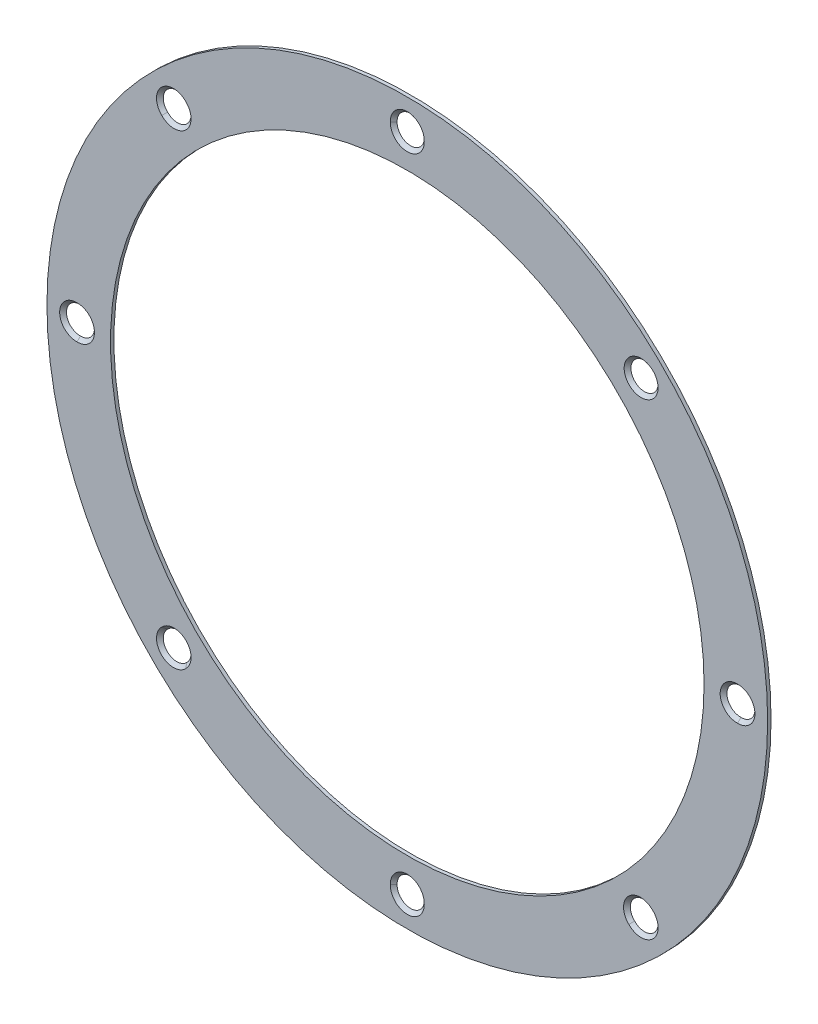
ISO-10303-21;
HEADER;
FILE_DESCRIPTION(('STEP AP214'),'2;1');
FILE_NAME('part.step','',(''),(''),'','','');
FILE_SCHEMA(('AUTOMOTIVE_DESIGN { 1 0 10303 214 1 1 1 1 }'));
ENDSEC;
DATA;
#1=APPLICATION_CONTEXT('core data for automotive mechanical design processes');
#2=APPLICATION_PROTOCOL_DEFINITION('international standard','automotive_design',2000,#1);
#3=PRODUCT_CONTEXT('',#1,'mechanical');
#4=PRODUCT('Part','Part','',(#3));
#5=PRODUCT_RELATED_PRODUCT_CATEGORY('part','',(#4));
#6=PRODUCT_DEFINITION_FORMATION('','',#4);
#7=PRODUCT_DEFINITION_CONTEXT('part definition',#1,'design');
#8=PRODUCT_DEFINITION('design','',#6,#7);
#9=PRODUCT_DEFINITION_SHAPE('','',#8);
#10=(LENGTH_UNIT() NAMED_UNIT(*) SI_UNIT(.MILLI.,.METRE.));
#11=(NAMED_UNIT(*) PLANE_ANGLE_UNIT() SI_UNIT($,.RADIAN.));
#12=(NAMED_UNIT(*) SI_UNIT($,.STERADIAN.) SOLID_ANGLE_UNIT());
#13=UNCERTAINTY_MEASURE_WITH_UNIT(LENGTH_MEASURE(1.E-05),#10,'distance_accuracy_value','');
#14=(GEOMETRIC_REPRESENTATION_CONTEXT(3) GLOBAL_UNCERTAINTY_ASSIGNED_CONTEXT((#13)) GLOBAL_UNIT_ASSIGNED_CONTEXT((#10,
#11,#12)) REPRESENTATION_CONTEXT('',''));
#15=CARTESIAN_POINT('',(0.,0.,0.));
#16=DIRECTION('',(0.,0.,1.));
#17=DIRECTION('',(1.,0.,0.));
#18=AXIS2_PLACEMENT_3D('',#15,#16,#17);
#19=CARTESIAN_POINT('',(0.,0.,0.));
#20=DIRECTION('',(0.,0.,1.));
#21=DIRECTION('',(1.,0.,0.));
#22=AXIS2_PLACEMENT_3D('',#19,#20,#21);
#23=PLANE('',#22);
#24=CARTESIAN_POINT('',(-55.0104462833951,55.0104462834001,0.));
#25=DIRECTION('',(0.,0.,1.));
#26=DIRECTION('',(1.,0.,0.));
#27=AXIS2_PLACEMENT_3D('',#24,#25,#26);
#28=CIRCLE('',#27,3.20000000000002);
#29=CARTESIAN_POINT('',(-57.343985371903,52.8207898440457,0.));
#30=VERTEX_POINT('',#29);
#31=CARTESIAN_POINT('',(-52.8207898440403,57.3439853719075,0.));
#32=VERTEX_POINT('',#31);
#33=EDGE_CURVE('E172',#30,#32,#28,.T.);
#34=ORIENTED_EDGE('',*,*,#33,.T.);
#35=CARTESIAN_POINT('',(-55.1543289325482,55.1543289325532,0.));
#36=DIRECTION('',(0.,0.,1.));
#37=DIRECTION('',(1.,0.,0.));
#38=AXIS2_PLACEMENT_3D('',#35,#36,#37);
#39=CIRCLE('',#38,3.20000000000002);
#40=EDGE_CURVE('E163',#32,#30,#39,.T.);
#41=ORIENTED_EDGE('',*,*,#40,.T.);
#42=EDGE_LOOP('',(#34,#41));
#43=FACE_BOUND('',#42,.T.);
#44=CARTESIAN_POINT('',(-77.7965192061775,3.36536354339501E-12,0.));
#45=DIRECTION('',(0.,0.,1.));
#46=DIRECTION('',(1.,0.,0.));
#47=AXIS2_PLACEMENT_3D('',#44,#45,#46);
#48=CIRCLE('',#47,3.20000000000001);
#49=CARTESIAN_POINT('',(-77.8982596030892,-3.19838223038066,0.));
#50=VERTEX_POINT('',#49);
#51=CARTESIAN_POINT('',(-77.8982596030883,3.19838223038742,0.));
#52=VERTEX_POINT('',#51);
#53=EDGE_CURVE('E189',#50,#52,#48,.T.);
#54=ORIENTED_EDGE('',*,*,#53,.T.);
#55=CARTESIAN_POINT('',(-78.,3.39225324350902E-12,0.));
#56=DIRECTION('',(0.,0.,1.));
#57=DIRECTION('',(1.,0.,0.));
#58=AXIS2_PLACEMENT_3D('',#55,#56,#57);
#59=CIRCLE('',#58,3.20000000000001);
#60=EDGE_CURVE('E180',#52,#50,#59,.T.);
#61=ORIENTED_EDGE('',*,*,#60,.T.);
#62=EDGE_LOOP('',(#54,#61));
#63=FACE_BOUND('',#62,.T.);
#64=CARTESIAN_POINT('',(-55.0104462833995,-55.0104462833957,0.));
#65=DIRECTION('',(0.,0.,1.));
#66=DIRECTION('',(1.,0.,0.));
#67=AXIS2_PLACEMENT_3D('',#64,#65,#66);
#68=CIRCLE('',#67,3.20000000000002);
#69=CARTESIAN_POINT('',(-52.8207898440514,-57.3439853719094,0.));
#70=VERTEX_POINT('',#69);
#71=CARTESIAN_POINT('',(-57.3439853719012,-52.8207898440347,0.));
#72=VERTEX_POINT('',#71);
#73=EDGE_CURVE('E200',#70,#72,#68,.T.);
#74=ORIENTED_EDGE('',*,*,#73,.T.);
#75=CARTESIAN_POINT('',(-55.154328932553,-55.1543289325484,0.));
#76=DIRECTION('',(0.,0.,1.));
#77=DIRECTION('',(1.,0.,0.));
#78=AXIS2_PLACEMENT_3D('',#75,#76,#77);
#79=CIRCLE('',#78,3.20000000000002);
#80=EDGE_CURVE('E178',#72,#70,#79,.T.);
#81=ORIENTED_EDGE('',*,*,#80,.T.);
#82=EDGE_LOOP('',(#74,#81));
#83=FACE_BOUND('',#82,.T.);
#84=CARTESIAN_POINT('',(-3.10168557504653E-12,-77.7965192061775,0.));
#85=DIRECTION('',(0.,0.,1.));
#86=DIRECTION('',(1.,0.,0.));
#87=AXIS2_PLACEMENT_3D('',#84,#85,#86);
#88=CIRCLE('',#87,3.20000000000001);
#89=CARTESIAN_POINT('',(3.19838223038121,-77.8982596030805,0.));
#90=VERTEX_POINT('',#89);
#91=CARTESIAN_POINT('',(-3.19838223038688,-77.898259603097,0.));
#92=VERTEX_POINT('',#91);
#93=EDGE_CURVE('E211',#90,#92,#88,.T.);
#94=ORIENTED_EDGE('',*,*,#93,.T.);
#95=CARTESIAN_POINT('',(-2.57524661021973E-12,-78.,0.));
#96=DIRECTION('',(0.,0.,1.));
#97=DIRECTION('',(1.,0.,0.));
#98=AXIS2_PLACEMENT_3D('',#95,#96,#97);
#99=CIRCLE('',#98,3.20000000000001);
#100=EDGE_CURVE('E194',#92,#90,#99,.T.);
#101=ORIENTED_EDGE('',*,*,#100,.T.);
#102=EDGE_LOOP('',(#94,#101));
#103=FACE_BOUND('',#102,.T.);
#104=CARTESIAN_POINT('',(55.0104462833955,-55.0104462833997,0.));
#105=DIRECTION('',(0.,0.,1.));
#106=DIRECTION('',(1.,0.,0.));
#107=AXIS2_PLACEMENT_3D('',#104,#105,#106);
#108=CIRCLE('',#107,3.20000000000002);
#109=CARTESIAN_POINT('',(57.3439853719034,-52.8207898440454,0.));
#110=VERTEX_POINT('',#109);
#111=CARTESIAN_POINT('',(52.8207898440407,-57.3439853719072,0.));
#112=VERTEX_POINT('',#111);
#113=EDGE_CURVE('E222',#110,#112,#108,.T.);
#114=ORIENTED_EDGE('',*,*,#113,.T.);
#115=CARTESIAN_POINT('',(55.1543289325486,-55.1543289325528,0.));
#116=DIRECTION('',(0.,0.,1.));
#117=DIRECTION('',(1.,0.,0.));
#118=AXIS2_PLACEMENT_3D('',#115,#116,#117);
#119=CIRCLE('',#118,3.20000000000002);
#120=EDGE_CURVE('E205',#112,#110,#119,.T.);
#121=ORIENTED_EDGE('',*,*,#120,.T.);
#122=EDGE_LOOP('',(#114,#121));
#123=FACE_BOUND('',#122,.T.);
#124=CARTESIAN_POINT('',(55.1543289325526,55.1543289325488,0.));
#125=DIRECTION('',(0.,0.,1.));
#126=DIRECTION('',(1.,0.,0.));
#127=AXIS2_PLACEMENT_3D('',#124,#125,#126);
#128=CIRCLE('',#127,3.20000000000002);
#129=CARTESIAN_POINT('',(58.3543289325526,55.1543289325488,0.));
#130=VERTEX_POINT('',#129);
#131=EDGE_CURVE('E228',#130,#130,#128,.T.);
#132=ORIENTED_EDGE('',*,*,#131,.T.);
#133=EDGE_LOOP('',(#132));
#134=FACE_BOUND('',#133,.T.);
#135=CARTESIAN_POINT('',(77.7965192061775,-2.81719092498633E-12,0.));
#136=DIRECTION('',(0.,0.,1.));
#137=DIRECTION('',(1.,0.,0.));
#138=AXIS2_PLACEMENT_3D('',#135,#136,#137);
#139=CIRCLE('',#138,3.20000000000001);
#140=CARTESIAN_POINT('',(77.8982596030892,3.19838223038121,0.));
#141=VERTEX_POINT('',#140);
#142=CARTESIAN_POINT('',(77.8982596030883,-3.19838223038687,0.));
#143=VERTEX_POINT('',#142);
#144=EDGE_CURVE('E234',#141,#143,#139,.T.);
#145=ORIENTED_EDGE('',*,*,#144,.T.);
#146=CARTESIAN_POINT('',(78.,-2.84758215464949E-12,0.));
#147=DIRECTION('',(0.,0.,1.));
#148=DIRECTION('',(1.,0.,0.));
#149=AXIS2_PLACEMENT_3D('',#146,#147,#148);
#150=CIRCLE('',#149,3.20000000000001);
#151=EDGE_CURVE('E216',#143,#141,#150,.T.);
#152=ORIENTED_EDGE('',*,*,#151,.T.);
#153=EDGE_LOOP('',(#145,#152));
#154=FACE_BOUND('',#153,.T.);
#155=CARTESIAN_POINT('',(0.,0.,0.));
#156=DIRECTION('',(0.,0.,1.));
#157=DIRECTION('',(1.,0.,0.));
#158=AXIS2_PLACEMENT_3D('',#155,#156,#157);
#159=CIRCLE('',#158,70.);
#160=CARTESIAN_POINT('',(70.,0.,0.));
#161=VERTEX_POINT('',#160);
#162=EDGE_CURVE('E240',#161,#161,#159,.T.);
#163=ORIENTED_EDGE('',*,*,#162,.T.);
#164=EDGE_LOOP('',(#163));
#165=FACE_BOUND('',#164,.T.);
#166=CARTESIAN_POINT('',(2.57524661021973E-12,78.,0.));
#167=DIRECTION('',(0.,0.,1.));
#168=DIRECTION('',(1.,0.,0.));
#169=AXIS2_PLACEMENT_3D('',#166,#167,#168);
#170=CIRCLE('',#169,3.20000000000001);
#171=CARTESIAN_POINT('',(3.19838223038715,77.8982596031054,0.));
#172=VERTEX_POINT('',#171);
#173=CARTESIAN_POINT('',(-3.19838223038094,77.8982596030721,0.));
#174=VERTEX_POINT('',#173);
#175=EDGE_CURVE('E246',#172,#174,#170,.T.);
#176=ORIENTED_EDGE('',*,*,#175,.T.);
#177=CARTESIAN_POINT('',(3.63598040564739E-12,77.7965192061775,0.));
#178=DIRECTION('',(0.,0.,1.));
#179=DIRECTION('',(1.,0.,0.));
#180=AXIS2_PLACEMENT_3D('',#177,#178,#179);
#181=CIRCLE('',#180,3.20000000000001);
#182=EDGE_CURVE('E709',#174,#172,#181,.T.);
#183=ORIENTED_EDGE('',*,*,#182,.T.);
#184=EDGE_LOOP('',(#176,#183));
#185=FACE_BOUND('',#184,.T.);
#186=CARTESIAN_POINT('',(0.,0.,0.));
#187=DIRECTION('',(0.,0.,1.));
#188=DIRECTION('',(1.,0.,0.));
#189=AXIS2_PLACEMENT_3D('',#186,#187,#188);
#190=CIRCLE('',#189,85.);
#191=CARTESIAN_POINT('',(85.,0.,0.));
#192=VERTEX_POINT('',#191);
#193=EDGE_CURVE('E254',#192,#192,#190,.T.);
#194=ORIENTED_EDGE('',*,*,#193,.F.);
#195=EDGE_LOOP('',(#194));
#196=FACE_BOUND('',#195,.T.);
#197=ADVANCED_FACE('F59',(#43,#63,#83,#103,#123,#134,#154,#165,#185,#196),#23,.F.);
#198=CARTESIAN_POINT('',(0.,0.,0.8));
#199=DIRECTION('',(0.,0.,1.));
#200=DIRECTION('',(1.,0.,0.));
#201=AXIS2_PLACEMENT_3D('',#198,#199,#200);
#202=PLANE('',#201);
#203=CARTESIAN_POINT('',(-55.1543289325482,55.1543289325532,0.8));
#204=DIRECTION('',(0.,0.,1.));
#205=DIRECTION('',(1.,0.,0.));
#206=AXIS2_PLACEMENT_3D('',#203,#204,#205);
#207=CIRCLE('',#206,4.00000000000001);
#208=CARTESIAN_POINT('',(-52.2548755486128,57.909899667335,0.8));
#209=VERTEX_POINT('',#208);
#210=CARTESIAN_POINT('',(-57.9098996673305,52.2548755486183,0.8));
#211=VERTEX_POINT('',#210);
#212=EDGE_CURVE('E79',#209,#211,#207,.T.);
#213=ORIENTED_EDGE('',*,*,#212,.F.);
#214=CARTESIAN_POINT('',(-55.0104462833951,55.0104462834001,0.8));
#215=DIRECTION('',(0.,0.,1.));
#216=DIRECTION('',(1.,0.,0.));
#217=AXIS2_PLACEMENT_3D('',#214,#215,#216);
#218=CIRCLE('',#217,4.00000000000001);
#219=EDGE_CURVE('E174',#211,#209,#218,.T.);
#220=ORIENTED_EDGE('',*,*,#219,.F.);
#221=EDGE_LOOP('',(#213,#220));
#222=FACE_BOUND('',#221,.T.);
#223=CARTESIAN_POINT('',(3.63598040564739E-12,77.7965192061775,0.8));
#224=DIRECTION('',(0.,0.,1.));
#225=DIRECTION('',(1.,0.,0.));
#226=AXIS2_PLACEMENT_3D('',#223,#224,#225);
#227=CIRCLE('',#226,4.00000000000001);
#228=CARTESIAN_POINT('',(-3.99870590211529,77.8982596030679,0.8));
#229=VERTEX_POINT('',#228);
#230=CARTESIAN_POINT('',(3.9987059021215,77.8982596031096,0.8));
#231=VERTEX_POINT('',#230);
#232=EDGE_CURVE('E87',#229,#231,#227,.T.);
#233=ORIENTED_EDGE('',*,*,#232,.F.);
#234=CARTESIAN_POINT('',(2.57524661021973E-12,78.,0.8));
#235=DIRECTION('',(0.,0.,1.));
#236=DIRECTION('',(1.,0.,0.));
#237=AXIS2_PLACEMENT_3D('',#234,#235,#236);
#238=CIRCLE('',#237,4.00000000000001);
#239=EDGE_CURVE('E243',#231,#229,#238,.T.);
#240=ORIENTED_EDGE('',*,*,#239,.F.);
#241=EDGE_LOOP('',(#233,#240));
#242=FACE_BOUND('',#241,.T.);
#243=CARTESIAN_POINT('',(-78.,3.39225324350902E-12,0.8));
#244=DIRECTION('',(0.,0.,1.));
#245=DIRECTION('',(1.,0.,0.));
#246=AXIS2_PLACEMENT_3D('',#243,#244,#245);
#247=CIRCLE('',#246,4.00000000000002);
#248=CARTESIAN_POINT('',(-77.8982596030882,3.99870590212177,0.8));
#249=VERTEX_POINT('',#248);
#250=CARTESIAN_POINT('',(-77.8982596030893,-3.99870590211502,0.8));
#251=VERTEX_POINT('',#250);
#252=EDGE_CURVE('E714',#249,#251,#247,.T.);
#253=ORIENTED_EDGE('',*,*,#252,.F.);
#254=CARTESIAN_POINT('',(-77.7965192061775,3.36536354339501E-12,0.8));
#255=DIRECTION('',(0.,0.,1.));
#256=DIRECTION('',(1.,0.,0.));
#257=AXIS2_PLACEMENT_3D('',#254,#255,#256);
#258=CIRCLE('',#257,4.00000000000002);
#259=EDGE_CURVE('E186',#251,#249,#258,.T.);
#260=ORIENTED_EDGE('',*,*,#259,.F.);
#261=EDGE_LOOP('',(#253,#260));
#262=FACE_BOUND('',#261,.T.);
#263=CARTESIAN_POINT('',(-55.154328932553,-55.1543289325484,0.8));
#264=DIRECTION('',(0.,0.,1.));
#265=DIRECTION('',(1.,0.,0.));
#266=AXIS2_PLACEMENT_3D('',#263,#264,#265);
#267=CIRCLE('',#266,4.00000000000001);
#268=CARTESIAN_POINT('',(-57.9098996673272,-52.2548755486058,0.8));
#269=VERTEX_POINT('',#268);
#270=CARTESIAN_POINT('',(-52.2548755486255,-57.9098996673385,0.8));
#271=VERTEX_POINT('',#270);
#272=EDGE_CURVE('E176',#269,#271,#267,.T.);
#273=ORIENTED_EDGE('',*,*,#272,.F.);
#274=CARTESIAN_POINT('',(-55.0104462833995,-55.0104462833957,0.8));
#275=DIRECTION('',(0.,0.,1.));
#276=DIRECTION('',(1.,0.,0.));
#277=AXIS2_PLACEMENT_3D('',#274,#275,#276);
#278=CIRCLE('',#277,4.00000000000002);
#279=EDGE_CURVE('E197',#271,#269,#278,.T.);
#280=ORIENTED_EDGE('',*,*,#279,.F.);
#281=EDGE_LOOP('',(#273,#280));
#282=FACE_BOUND('',#281,.T.);
#283=CARTESIAN_POINT('',(-2.57524661021973E-12,-78.,0.8));
#284=DIRECTION('',(0.,0.,1.));
#285=DIRECTION('',(1.,0.,0.));
#286=AXIS2_PLACEMENT_3D('',#283,#284,#285);
#287=CIRCLE('',#286,4.00000000000001);
#288=CARTESIAN_POINT('',(-3.99870590212123,-77.8982596030991,0.8));
#289=VERTEX_POINT('',#288);
#290=CARTESIAN_POINT('',(3.99870590211555,-77.8982596030784,0.8));
#291=VERTEX_POINT('',#290);
#292=EDGE_CURVE('E192',#289,#291,#287,.T.);
#293=ORIENTED_EDGE('',*,*,#292,.F.);
#294=CARTESIAN_POINT('',(-3.10168557504653E-12,-77.7965192061775,0.8));
#295=DIRECTION('',(0.,0.,1.));
#296=DIRECTION('',(1.,0.,0.));
#297=AXIS2_PLACEMENT_3D('',#294,#295,#296);
#298=CIRCLE('',#297,4.00000000000001);
#299=EDGE_CURVE('E208',#291,#289,#298,.T.);
#300=ORIENTED_EDGE('',*,*,#299,.F.);
#301=EDGE_LOOP('',(#293,#300));
#302=FACE_BOUND('',#301,.T.);
#303=CARTESIAN_POINT('',(55.1543289325486,-55.1543289325528,0.8));
#304=DIRECTION('',(0.,0.,1.));
#305=DIRECTION('',(1.,0.,0.));
#306=AXIS2_PLACEMENT_3D('',#303,#304,#305);
#307=CIRCLE('',#306,4.00000000000002);
#308=CARTESIAN_POINT('',(52.2548755486132,-57.9098996673346,0.8));
#309=VERTEX_POINT('',#308);
#310=CARTESIAN_POINT('',(57.9098996673309,-52.2548755486179,0.8));
#311=VERTEX_POINT('',#310);
#312=EDGE_CURVE('E203',#309,#311,#307,.T.);
#313=ORIENTED_EDGE('',*,*,#312,.F.);
#314=CARTESIAN_POINT('',(55.0104462833955,-55.0104462833997,0.8));
#315=DIRECTION('',(0.,0.,1.));
#316=DIRECTION('',(1.,0.,0.));
#317=AXIS2_PLACEMENT_3D('',#314,#315,#316);
#318=CIRCLE('',#317,4.00000000000002);
#319=EDGE_CURVE('E219',#311,#309,#318,.T.);
#320=ORIENTED_EDGE('',*,*,#319,.F.);
#321=EDGE_LOOP('',(#313,#320));
#322=FACE_BOUND('',#321,.T.);
#323=CARTESIAN_POINT('',(78.,-2.84758215464949E-12,0.8));
#324=DIRECTION('',(0.,0.,1.));
#325=DIRECTION('',(1.,0.,0.));
#326=AXIS2_PLACEMENT_3D('',#323,#324,#325);
#327=CIRCLE('',#326,4.00000000000002);
#328=CARTESIAN_POINT('',(77.8982596030882,-3.99870590212123,0.8));
#329=VERTEX_POINT('',#328);
#330=CARTESIAN_POINT('',(77.8982596030894,3.99870590211556,0.8));
#331=VERTEX_POINT('',#330);
#332=EDGE_CURVE('E214',#329,#331,#327,.T.);
#333=ORIENTED_EDGE('',*,*,#332,.F.);
#334=CARTESIAN_POINT('',(77.7965192061775,-2.81719092498633E-12,0.8));
#335=DIRECTION('',(0.,0.,1.));
#336=DIRECTION('',(1.,0.,0.));
#337=AXIS2_PLACEMENT_3D('',#334,#335,#336);
#338=CIRCLE('',#337,4.00000000000002);
#339=EDGE_CURVE('E231',#331,#329,#338,.T.);
#340=ORIENTED_EDGE('',*,*,#339,.F.);
#341=EDGE_LOOP('',(#333,#340));
#342=FACE_BOUND('',#341,.T.);
#343=CARTESIAN_POINT('',(55.1543289325526,55.1543289325488,0.8));
#344=DIRECTION('',(0.,0.,1.));
#345=DIRECTION('',(1.,0.,0.));
#346=AXIS2_PLACEMENT_3D('',#343,#344,#345);
#347=CIRCLE('',#346,4.00000000000002);
#348=CARTESIAN_POINT('',(59.1543289325526,55.1543289325488,0.8));
#349=VERTEX_POINT('',#348);
#350=EDGE_CURVE('E225',#349,#349,#347,.T.);
#351=ORIENTED_EDGE('',*,*,#350,.F.);
#352=EDGE_LOOP('',(#351));
#353=FACE_BOUND('',#352,.T.);
#354=CARTESIAN_POINT('',(0.,0.,0.799999999999993));
#355=DIRECTION('',(0.,0.,1.));
#356=DIRECTION('',(1.,0.,0.));
#357=AXIS2_PLACEMENT_3D('',#354,#355,#356);
#358=CIRCLE('',#357,70.);
#359=CARTESIAN_POINT('',(70.,0.,0.799999999999993));
#360=VERTEX_POINT('',#359);
#361=EDGE_CURVE('E237',#360,#360,#358,.T.);
#362=ORIENTED_EDGE('',*,*,#361,.F.);
#363=EDGE_LOOP('',(#362));
#364=FACE_BOUND('',#363,.T.);
#365=CARTESIAN_POINT('',(0.,0.,0.8));
#366=DIRECTION('',(0.,0.,1.));
#367=DIRECTION('',(1.,0.,0.));
#368=AXIS2_PLACEMENT_3D('',#365,#366,#367);
#369=CIRCLE('',#368,85.);
#370=CARTESIAN_POINT('',(85.,0.,0.8));
#371=VERTEX_POINT('',#370);
#372=EDGE_CURVE('E249',#371,#371,#369,.T.);
#373=ORIENTED_EDGE('',*,*,#372,.T.);
#374=EDGE_LOOP('',(#373));
#375=FACE_BOUND('',#374,.T.);
#376=ADVANCED_FACE('F537',(#222,#242,#262,#282,#302,#322,#342,#353,#364,#375),#202,.T.);
#377=CARTESIAN_POINT('',(0.,0.,0.8));
#378=DIRECTION('',(0.,0.,-1.));
#379=DIRECTION('',(-1.,0.,0.));
#380=AXIS2_PLACEMENT_3D('',#377,#378,#379);
#381=CYLINDRICAL_SURFACE('',#380,85.);
#382=ORIENTED_EDGE('',*,*,#193,.T.);
#383=EDGE_LOOP('',(#382));
#384=FACE_BOUND('',#383,.T.);
#385=ORIENTED_EDGE('',*,*,#372,.F.);
#386=EDGE_LOOP('',(#385));
#387=FACE_BOUND('',#386,.T.);
#388=ADVANCED_FACE('F535',(#384,#387),#381,.T.);
#389=CARTESIAN_POINT('',(2.57524661021973E-12,78.,0.8));
#390=DIRECTION('',(0.,0.,1.));
#391=DIRECTION('',(1.,0.,0.));
#392=AXIS2_PLACEMENT_3D('',#389,#390,#391);
#393=CONICAL_SURFACE('',#392,4.00000000000001,0.785398163397452);
#394=ORIENTED_EDGE('',*,*,#239,.T.);
#395=CARTESIAN_POINT('',(-3.99890596683793,77.8982596030679,0.80020000000005));
#396=CARTESIAN_POINT('',(-3.86545799511278,77.8982596030686,0.666793996374641));
#397=CARTESIAN_POINT('',(-3.7320070227852,77.8982596030693,0.533390994565683));
#398=CARTESIAN_POINT('',(-3.46509907691018,77.8982596030707,0.266590994565668));
#399=CARTESIAN_POINT('',(-3.33164210336274,77.8982596030714,0.13319399637461));
#400=CARTESIAN_POINT('',(-3.19818212921287,77.8982596030721,-0.000199999999994917));
#401=B_SPLINE_CURVE_WITH_KNOTS('',3,(#395,#396,#397,#398,#399,#400),.UNSPECIFIED.,.F.,.F.,(4,2,
4),(0.,0.566082773242,1.13216554654768),.UNSPECIFIED.);
#402=EDGE_CURVE('E520',#229,#174,#401,.T.);
#403=ORIENTED_EDGE('',*,*,#402,.T.);
#404=ORIENTED_EDGE('',*,*,#175,.F.);
#405=CARTESIAN_POINT('',(3.19818212921908,77.8982596031054,-0.000199999999994968));
#406=CARTESIAN_POINT('',(3.33164210336895,77.8982596031061,0.13319399637461));
#407=CARTESIAN_POINT('',(3.46509907691639,77.8982596031068,0.266590994565668));
#408=CARTESIAN_POINT('',(3.73200702279141,77.8982596031082,0.533390994565684));
#409=CARTESIAN_POINT('',(3.86545799511899,77.8982596031089,0.666793996374641));
#410=CARTESIAN_POINT('',(3.99890596684414,77.8982596031096,0.800200000000051));
#411=B_SPLINE_CURVE_WITH_KNOTS('',3,(#405,#406,#407,#408,#409,#410),.UNSPECIFIED.,.F.,.F.,(4,2,
4),(0.,0.566082773305678,1.13216554654768),.UNSPECIFIED.);
#412=EDGE_CURVE('E502',#172,#231,#411,.T.);
#413=ORIENTED_EDGE('',*,*,#412,.T.);
#414=EDGE_LOOP('',(#394,#403,#404,#413));
#415=FACE_BOUND('',#414,.T.);
#416=ADVANCED_FACE('F530',(#415),#393,.F.);
#417=CARTESIAN_POINT('',(0.,0.,0.8));
#418=DIRECTION('',(0.,0.,1.));
#419=DIRECTION('',(1.,0.,0.));
#420=AXIS2_PLACEMENT_3D('',#417,#418,#419);
#421=CYLINDRICAL_SURFACE('',#420,70.);
#422=ORIENTED_EDGE('',*,*,#162,.F.);
#423=EDGE_LOOP('',(#422));
#424=FACE_BOUND('',#423,.T.);
#425=ORIENTED_EDGE('',*,*,#361,.T.);
#426=EDGE_LOOP('',(#425));
#427=FACE_BOUND('',#426,.T.);
#428=ADVANCED_FACE('F534',(#424,#427),#421,.F.);
#429=CARTESIAN_POINT('',(77.7965192061775,-2.81719092498633E-12,0.8));
#430=DIRECTION('',(0.,0.,1.));
#431=DIRECTION('',(1.,0.,0.));
#432=AXIS2_PLACEMENT_3D('',#429,#430,#431);
#433=CONICAL_SURFACE('',#432,4.00000000000002,0.785398163397457);
#434=ORIENTED_EDGE('',*,*,#339,.T.);
#435=CARTESIAN_POINT('',(77.8982596030882,-3.99890596684387,0.80020000000005));
#436=CARTESIAN_POINT('',(77.8982596030882,-3.86545799511872,0.666793996374641));
#437=CARTESIAN_POINT('',(77.8982596030882,-3.73200702279114,0.533390994565683));
#438=CARTESIAN_POINT('',(77.8982596030882,-3.46509907691611,0.266590994565667));
#439=CARTESIAN_POINT('',(77.8982596030883,-3.33164210336867,0.133193996374609));
#440=CARTESIAN_POINT('',(77.8982596030883,-3.1981821292188,-0.000199999999995134));
#441=B_SPLINE_CURVE_WITH_KNOTS('',3,(#435,#436,#437,#438,#439,#440),.UNSPECIFIED.,.F.,.F.,(4,2,
4),(0.,0.566082773242003,1.13216554654768),.UNSPECIFIED.);
#442=EDGE_CURVE('E402',#329,#143,#441,.T.);
#443=ORIENTED_EDGE('',*,*,#442,.T.);
#444=ORIENTED_EDGE('',*,*,#144,.F.);
#445=CARTESIAN_POINT('',(77.8982596030892,3.19818212921314,-0.000199999999994853));
#446=CARTESIAN_POINT('',(77.8982596030893,3.33164210336301,0.13319399637461));
#447=CARTESIAN_POINT('',(77.8982596030893,3.46509907691045,0.266590994565667));
#448=CARTESIAN_POINT('',(77.8982596030893,3.73200702278547,0.533390994565683));
#449=CARTESIAN_POINT('',(77.8982596030893,3.86545799511305,0.66679399637464));
#450=CARTESIAN_POINT('',(77.8982596030894,3.99890596683821,0.80020000000005));
#451=B_SPLINE_CURVE_WITH_KNOTS('',3,(#445,#446,#447,#448,#449,#450),.UNSPECIFIED.,.F.,.F.,(4,2,
4),(0.,0.566082773305681,1.13216554654768),.UNSPECIFIED.);
#452=EDGE_CURVE('E393',#141,#331,#451,.T.);
#453=ORIENTED_EDGE('',*,*,#452,.T.);
#454=EDGE_LOOP('',(#434,#443,#444,#453));
#455=FACE_BOUND('',#454,.T.);
#456=ADVANCED_FACE('F408',(#455),#433,.F.);
#457=CARTESIAN_POINT('',(55.1543289325526,55.1543289325488,0.8));
#458=DIRECTION('',(0.,0.,1.));
#459=DIRECTION('',(1.,0.,0.));
#460=AXIS2_PLACEMENT_3D('',#457,#458,#459);
#461=CONICAL_SURFACE('',#460,4.00000000000002,0.785398163397453);
#462=ORIENTED_EDGE('',*,*,#131,.F.);
#463=EDGE_LOOP('',(#462));
#464=FACE_BOUND('',#463,.T.);
#465=ORIENTED_EDGE('',*,*,#350,.T.);
#466=EDGE_LOOP('',(#465));
#467=FACE_BOUND('',#466,.T.);
#468=ADVANCED_FACE('F425',(#464,#467),#461,.F.);
#469=CARTESIAN_POINT('',(55.0104462833955,-55.0104462833997,0.8));
#470=DIRECTION('',(0.,0.,1.));
#471=DIRECTION('',(1.,0.,0.));
#472=AXIS2_PLACEMENT_3D('',#469,#470,#471);
#473=CONICAL_SURFACE('',#472,4.00000000000002,0.785398163397453);
#474=ORIENTED_EDGE('',*,*,#319,.T.);
#475=CARTESIAN_POINT('',(52.2547340814912,-57.9100411344566,0.8002));
#476=CARTESIAN_POINT('',(52.3490960472336,-57.8156791687142,0.666793996374599));
#477=CARTESIAN_POINT('',(52.4434601347224,-57.7213150812254,0.53339099456565));
#478=CARTESIAN_POINT('',(52.6321925532032,-57.5325826627446,0.26659099456565));
#479=CARTESIAN_POINT('',(52.7265608841952,-57.4382143317526,0.133193996374599));
#480=CARTESIAN_POINT('',(52.8209313369336,-57.3438438790143,-0.000199999999998221));
#481=B_SPLINE_CURVE_WITH_KNOTS('',3,(#475,#476,#477,#478,#479,#480),.UNSPECIFIED.,.F.,.F.,(4,2,
4),(0.,0.566082773241963,1.13216554654761),.UNSPECIFIED.);
#482=EDGE_CURVE('E434',#309,#112,#481,.T.);
#483=ORIENTED_EDGE('',*,*,#482,.T.);
#484=ORIENTED_EDGE('',*,*,#113,.F.);
#485=CARTESIAN_POINT('',(57.3438438790105,-52.8209313369382,-0.00019999999996513));
#486=CARTESIAN_POINT('',(57.4382143317489,-52.7265608841999,0.133193996374626));
#487=CARTESIAN_POINT('',(57.5325826627409,-52.6321925532079,0.26659099456567));
#488=CARTESIAN_POINT('',(57.7213150812217,-52.4434601347271,0.533390994565658));
#489=CARTESIAN_POINT('',(57.8156791687105,-52.3490960472383,0.666793996374602));
#490=CARTESIAN_POINT('',(57.9100411344529,-52.2547340814959,0.800199999999999));
#491=B_SPLINE_CURVE_WITH_KNOTS('',3,(#485,#486,#487,#488,#489,#490),.UNSPECIFIED.,.F.,.F.,(4,2,
4),(0.,0.566082773305619,1.13216554654756),.UNSPECIFIED.);
#492=EDGE_CURVE('E428',#110,#311,#491,.T.);
#493=ORIENTED_EDGE('',*,*,#492,.T.);
#494=EDGE_LOOP('',(#474,#483,#484,#493));
#495=FACE_BOUND('',#494,.T.);
#496=ADVANCED_FACE('F418',(#495),#473,.F.);
#497=CARTESIAN_POINT('',(78.,-2.84758215464949E-12,0.8));
#498=DIRECTION('',(0.,0.,1.));
#499=DIRECTION('',(1.,0.,0.));
#500=AXIS2_PLACEMENT_3D('',#497,#498,#499);
#501=CONICAL_SURFACE('',#500,4.00000000000002,0.785398163397457);
#502=ORIENTED_EDGE('',*,*,#332,.T.);
#503=ORIENTED_EDGE('',*,*,#452,.F.);
#504=ORIENTED_EDGE('',*,*,#151,.F.);
#505=ORIENTED_EDGE('',*,*,#442,.F.);
#506=EDGE_LOOP('',(#502,#503,#504,#505));
#507=FACE_BOUND('',#506,.T.);
#508=ADVANCED_FACE('F412',(#507),#501,.F.);
#509=CARTESIAN_POINT('',(-3.10168557504653E-12,-77.7965192061775,0.8));
#510=DIRECTION('',(0.,0.,1.));
#511=DIRECTION('',(1.,0.,0.));
#512=AXIS2_PLACEMENT_3D('',#509,#510,#511);
#513=CONICAL_SURFACE('',#512,4.00000000000001,0.785398163397452);
#514=ORIENTED_EDGE('',*,*,#299,.T.);
#515=CARTESIAN_POINT('',(-3.99890596684388,-77.8982596030991,0.80020000000005));
#516=CARTESIAN_POINT('',(-3.86545799511872,-77.8982596030988,0.666793996374641));
#517=CARTESIAN_POINT('',(-3.73200702279114,-77.8982596030984,0.533390994565683));
#518=CARTESIAN_POINT('',(-3.46509907691612,-77.8982596030977,0.266590994565667));
#519=CARTESIAN_POINT('',(-3.33164210336868,-77.8982596030974,0.13319399637461));
#520=CARTESIAN_POINT('',(-3.19818212921881,-77.898259603097,-0.000199999999994809));
#521=B_SPLINE_CURVE_WITH_KNOTS('',3,(#515,#516,#517,#518,#519,#520),.UNSPECIFIED.,.F.,.F.,(4,2,
4),(0.,0.566082773242,1.13216554654768),.UNSPECIFIED.);
#522=EDGE_CURVE('E750',#289,#92,#521,.T.);
#523=ORIENTED_EDGE('',*,*,#522,.T.);
#524=ORIENTED_EDGE('',*,*,#93,.F.);
#525=CARTESIAN_POINT('',(3.19818212921314,-77.8982596030805,-0.000199999999995044));
#526=CARTESIAN_POINT('',(3.331642103363,-77.8982596030801,0.13319399637461));
#527=CARTESIAN_POINT('',(3.46509907691044,-77.8982596030798,0.266590994565667));
#528=CARTESIAN_POINT('',(3.73200702278546,-77.8982596030791,0.533390994565683));
#529=CARTESIAN_POINT('',(3.86545799511304,-77.8982596030788,0.66679399637464));
#530=CARTESIAN_POINT('',(3.9989059668382,-77.8982596030784,0.80020000000005));
#531=B_SPLINE_CURVE_WITH_KNOTS('',3,(#525,#526,#527,#528,#529,#530),.UNSPECIFIED.,.F.,.F.,(4,2,
4),(0.,0.566082773305678,1.13216554654768),.UNSPECIFIED.);
#532=EDGE_CURVE('E441',#90,#291,#531,.T.);
#533=ORIENTED_EDGE('',*,*,#532,.T.);
#534=EDGE_LOOP('',(#514,#523,#524,#533));
#535=FACE_BOUND('',#534,.T.);
#536=ADVANCED_FACE('F417',(#535),#513,.F.);
#537=CARTESIAN_POINT('',(55.1543289325486,-55.1543289325528,0.8));
#538=DIRECTION('',(0.,0.,1.));
#539=DIRECTION('',(1.,0.,0.));
#540=AXIS2_PLACEMENT_3D('',#537,#538,#539);
#541=CONICAL_SURFACE('',#540,4.00000000000002,0.785398163397453);
#542=ORIENTED_EDGE('',*,*,#312,.T.);
#543=ORIENTED_EDGE('',*,*,#492,.F.);
#544=ORIENTED_EDGE('',*,*,#120,.F.);
#545=ORIENTED_EDGE('',*,*,#482,.F.);
#546=EDGE_LOOP('',(#542,#543,#544,#545));
#547=FACE_BOUND('',#546,.T.);
#548=ADVANCED_FACE('F448',(#547),#541,.F.);
#549=CARTESIAN_POINT('',(-55.0104462833995,-55.0104462833957,0.8));
#550=DIRECTION('',(0.,0.,1.));
#551=DIRECTION('',(1.,0.,0.));
#552=AXIS2_PLACEMENT_3D('',#549,#550,#551);
#553=CONICAL_SURFACE('',#552,4.00000000000002,0.785398163397453);
#554=ORIENTED_EDGE('',*,*,#279,.T.);
#555=CARTESIAN_POINT('',(-57.9100411344492,-52.2547340814838,0.800199999999999));
#556=CARTESIAN_POINT('',(-57.815679168707,-52.3490960472264,0.666793996374602));
#557=CARTESIAN_POINT('',(-57.7213150812185,-52.4434601347155,0.533390994565658));
#558=CARTESIAN_POINT('',(-57.5325826627382,-52.6321925531967,0.266590994565669));
#559=CARTESIAN_POINT('',(-57.4382143317464,-52.726560884189,0.133193996374626));
#560=CARTESIAN_POINT('',(-57.3438438790083,-52.8209313369276,-0.000199999999963015));
#561=B_SPLINE_CURVE_WITH_KNOTS('',3,(#555,#556,#557,#558,#559,#560),.UNSPECIFIED.,.F.,.F.,(4,2,
4),(0.,0.566082773241944,1.13216554654756),.UNSPECIFIED.);
#562=EDGE_CURVE('E470',#269,#72,#561,.T.);
#563=ORIENTED_EDGE('',*,*,#562,.T.);
#564=ORIENTED_EDGE('',*,*,#73,.F.);
#565=CARTESIAN_POINT('',(-52.8209313369442,-57.3438438790165,-0.000199999999962752));
#566=CARTESIAN_POINT('',(-52.7265608842061,-57.4382143317552,0.133193996374626));
#567=CARTESIAN_POINT('',(-52.6321925532144,-57.5325826627475,0.26659099456567));
#568=CARTESIAN_POINT('',(-52.4434601347342,-57.7213150812288,0.533390994565657));
#569=CARTESIAN_POINT('',(-52.3490960472457,-57.8156791687178,0.666793996374601));
#570=CARTESIAN_POINT('',(-52.2547340815035,-57.9100411344605,0.800199999999997));
#571=B_SPLINE_CURVE_WITH_KNOTS('',3,(#565,#566,#567,#568,#569,#570),.UNSPECIFIED.,.F.,.F.,(4,2,
4),(0.,0.566082773305621,1.13216554654756),.UNSPECIFIED.);
#572=EDGE_CURVE('E463',#70,#271,#571,.T.);
#573=ORIENTED_EDGE('',*,*,#572,.T.);
#574=EDGE_LOOP('',(#554,#563,#564,#573));
#575=FACE_BOUND('',#574,.T.);
#576=ADVANCED_FACE('F452',(#575),#553,.F.);
#577=CARTESIAN_POINT('',(-2.57524661021973E-12,-78.,0.8));
#578=DIRECTION('',(0.,0.,1.));
#579=DIRECTION('',(1.,0.,0.));
#580=AXIS2_PLACEMENT_3D('',#577,#578,#579);
#581=CONICAL_SURFACE('',#580,4.00000000000001,0.785398163397452);
#582=ORIENTED_EDGE('',*,*,#292,.T.);
#583=ORIENTED_EDGE('',*,*,#532,.F.);
#584=ORIENTED_EDGE('',*,*,#100,.F.);
#585=ORIENTED_EDGE('',*,*,#522,.F.);
#586=EDGE_LOOP('',(#582,#583,#584,#585));
#587=FACE_BOUND('',#586,.T.);
#588=ADVANCED_FACE('F457',(#587),#581,.F.);
#589=CARTESIAN_POINT('',(-77.7965192061775,3.36536354339501E-12,0.8));
#590=DIRECTION('',(0.,0.,1.));
#591=DIRECTION('',(1.,0.,0.));
#592=AXIS2_PLACEMENT_3D('',#589,#590,#591);
#593=CONICAL_SURFACE('',#592,4.00000000000002,0.785398163397457);
#594=ORIENTED_EDGE('',*,*,#259,.T.);
#595=CARTESIAN_POINT('',(-77.8982596030882,3.99890596684442,0.80020000000005));
#596=CARTESIAN_POINT('',(-77.8982596030882,3.86545799511926,0.666793996374641));
#597=CARTESIAN_POINT('',(-77.8982596030883,3.73200702279168,0.533390994565683));
#598=CARTESIAN_POINT('',(-77.8982596030883,3.46509907691666,0.266590994565667));
#599=CARTESIAN_POINT('',(-77.8982596030883,3.33164210336922,0.13319399637461));
#600=CARTESIAN_POINT('',(-77.8982596030883,3.19818212921935,-0.000199999999994885));
#601=B_SPLINE_CURVE_WITH_KNOTS('',3,(#595,#596,#597,#598,#599,#600),.UNSPECIFIED.,.F.,.F.,(4,2,
4),(0.,0.566082773242003,1.13216554654768),.UNSPECIFIED.);
#602=EDGE_CURVE('E495',#249,#52,#601,.T.);
#603=ORIENTED_EDGE('',*,*,#602,.T.);
#604=ORIENTED_EDGE('',*,*,#53,.F.);
#605=CARTESIAN_POINT('',(-77.8982596030892,-3.19818212921259,-0.000199999999995121));
#606=CARTESIAN_POINT('',(-77.8982596030892,-3.33164210336246,0.13319399637461));
#607=CARTESIAN_POINT('',(-77.8982596030892,-3.4650990769099,0.266590994565667));
#608=CARTESIAN_POINT('',(-77.8982596030892,-3.73200702278493,0.533390994565683));
#609=CARTESIAN_POINT('',(-77.8982596030893,-3.86545799511251,0.666793996374641));
#610=CARTESIAN_POINT('',(-77.8982596030893,-3.99890596683766,0.80020000000005));
#611=B_SPLINE_CURVE_WITH_KNOTS('',3,(#605,#606,#607,#608,#609,#610),.UNSPECIFIED.,.F.,.F.,(4,2,
4),(0.,0.566082773305681,1.13216554654768),.UNSPECIFIED.);
#612=EDGE_CURVE('E477',#50,#251,#611,.T.);
#613=ORIENTED_EDGE('',*,*,#612,.T.);
#614=EDGE_LOOP('',(#594,#603,#604,#613));
#615=FACE_BOUND('',#614,.T.);
#616=ADVANCED_FACE('F487',(#615),#593,.F.);
#617=CARTESIAN_POINT('',(-55.154328932553,-55.1543289325484,0.8));
#618=DIRECTION('',(0.,0.,1.));
#619=DIRECTION('',(1.,0.,0.));
#620=AXIS2_PLACEMENT_3D('',#617,#618,#619);
#621=CONICAL_SURFACE('',#620,4.00000000000001,0.785398163397448);
#622=ORIENTED_EDGE('',*,*,#272,.T.);
#623=ORIENTED_EDGE('',*,*,#572,.F.);
#624=ORIENTED_EDGE('',*,*,#80,.F.);
#625=ORIENTED_EDGE('',*,*,#562,.F.);
#626=EDGE_LOOP('',(#622,#623,#624,#625));
#627=FACE_BOUND('',#626,.T.);
#628=ADVANCED_FACE('F484',(#627),#621,.F.);
#629=CARTESIAN_POINT('',(-55.0104462833951,55.0104462834001,0.8));
#630=DIRECTION('',(0.,0.,1.));
#631=DIRECTION('',(1.,0.,0.));
#632=AXIS2_PLACEMENT_3D('',#629,#630,#631);
#633=CONICAL_SURFACE('',#632,4.00000000000001,0.785398163397448);
#634=ORIENTED_EDGE('',*,*,#219,.T.);
#635=CARTESIAN_POINT('',(-52.2547340814908,57.910041134457,0.800200000000001));
#636=CARTESIAN_POINT('',(-52.3490960472332,57.8156791687145,0.666793996374607));
#637=CARTESIAN_POINT('',(-52.443460134722,57.7213150812258,0.533390994565663));
#638=CARTESIAN_POINT('',(-52.6321925532028,57.532582662745,0.266590994565674));
#639=CARTESIAN_POINT('',(-52.7265608841948,57.438214331753,0.133193996374629));
#640=CARTESIAN_POINT('',(-52.8209313369332,57.3438438790147,-0.000199999999964093));
#641=B_SPLINE_CURVE_WITH_KNOTS('',3,(#635,#636,#637,#638,#639,#640),.UNSPECIFIED.,.F.,.F.,(4,2,
4),(0.,0.566082773241941,1.13216554654756),.UNSPECIFIED.);
#642=EDGE_CURVE('E13',#209,#32,#641,.T.);
#643=ORIENTED_EDGE('',*,*,#642,.T.);
#644=ORIENTED_EDGE('',*,*,#33,.F.);
#645=CARTESIAN_POINT('',(-57.3438438790101,52.8209313369386,-0.000199999999996885));
#646=CARTESIAN_POINT('',(-57.4382143317485,52.7265608842003,0.133193996374598));
#647=CARTESIAN_POINT('',(-57.5325826627405,52.6321925532082,0.266590994565647));
#648=CARTESIAN_POINT('',(-57.7213150812213,52.4434601347275,0.533390994565647));
#649=CARTESIAN_POINT('',(-57.8156791687101,52.3490960472387,0.666793996374596));
#650=CARTESIAN_POINT('',(-57.9100411344525,52.2547340814963,0.800199999999999));
#651=B_SPLINE_CURVE_WITH_KNOTS('',3,(#645,#646,#647,#648,#649,#650),.UNSPECIFIED.,.F.,.F.,(4,2,
4),(0.,0.566082773305644,1.1321655465476),.UNSPECIFIED.);
#652=EDGE_CURVE('E72',#30,#211,#651,.T.);
#653=ORIENTED_EDGE('',*,*,#652,.T.);
#654=EDGE_LOOP('',(#634,#643,#644,#653));
#655=FACE_BOUND('',#654,.T.);
#656=ADVANCED_FACE('F171',(#655),#633,.F.);
#657=CARTESIAN_POINT('',(-78.,3.39225324350902E-12,0.8));
#658=DIRECTION('',(0.,0.,1.));
#659=DIRECTION('',(1.,0.,0.));
#660=AXIS2_PLACEMENT_3D('',#657,#658,#659);
#661=CONICAL_SURFACE('',#660,4.00000000000002,0.785398163397457);
#662=ORIENTED_EDGE('',*,*,#252,.T.);
#663=ORIENTED_EDGE('',*,*,#612,.F.);
#664=ORIENTED_EDGE('',*,*,#60,.F.);
#665=ORIENTED_EDGE('',*,*,#602,.F.);
#666=EDGE_LOOP('',(#662,#663,#664,#665));
#667=FACE_BOUND('',#666,.T.);
#668=ADVANCED_FACE('F510',(#667),#661,.F.);
#669=CARTESIAN_POINT('',(3.63598040564739E-12,77.7965192061775,0.8));
#670=DIRECTION('',(0.,0.,1.));
#671=DIRECTION('',(1.,0.,0.));
#672=AXIS2_PLACEMENT_3D('',#669,#670,#671);
#673=CONICAL_SURFACE('',#672,4.00000000000001,0.785398163397452);
#674=ORIENTED_EDGE('',*,*,#232,.T.);
#675=ORIENTED_EDGE('',*,*,#412,.F.);
#676=ORIENTED_EDGE('',*,*,#182,.F.);
#677=ORIENTED_EDGE('',*,*,#402,.F.);
#678=EDGE_LOOP('',(#674,#675,#676,#677));
#679=FACE_BOUND('',#678,.T.);
#680=ADVANCED_FACE('F513',(#679),#673,.F.);
#681=CARTESIAN_POINT('',(-55.1543289325482,55.1543289325532,0.8));
#682=DIRECTION('',(0.,0.,1.));
#683=DIRECTION('',(1.,0.,0.));
#684=AXIS2_PLACEMENT_3D('',#681,#682,#683);
#685=CONICAL_SURFACE('',#684,4.00000000000001,0.785398163397448);
#686=ORIENTED_EDGE('',*,*,#212,.T.);
#687=ORIENTED_EDGE('',*,*,#652,.F.);
#688=ORIENTED_EDGE('',*,*,#40,.F.);
#689=ORIENTED_EDGE('',*,*,#642,.F.);
#690=EDGE_LOOP('',(#686,#687,#688,#689));
#691=FACE_BOUND('',#690,.T.);
#692=ADVANCED_FACE('F164',(#691),#685,.F.);
#693=CLOSED_SHELL('',(#197,#376,#388,#416,#428,#456,#468,#496,#508,#536,#548,#576,#588,#616,
#628,#656,#668,#680,#692));
#694=MANIFOLD_SOLID_BREP('B2',#693);
#695=ADVANCED_BREP_SHAPE_REPRESENTATION('',(#18,#694),#14);
#696=SHAPE_DEFINITION_REPRESENTATION(#9,#695);
ENDSEC;
END-ISO-10303-21;
